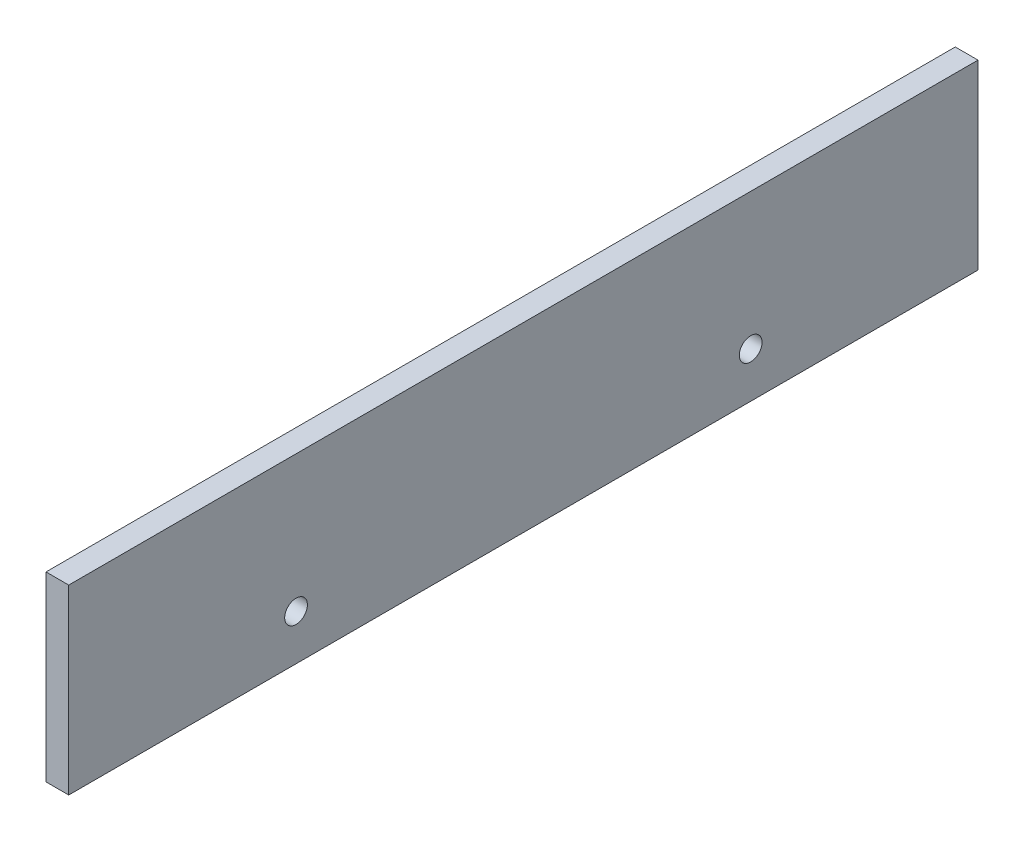
ISO-10303-21;
HEADER;
FILE_DESCRIPTION(('STEP AP214'),'2;1');
FILE_NAME('part.step','',(''),(''),'','','');
FILE_SCHEMA(('AUTOMOTIVE_DESIGN { 1 0 10303 214 1 1 1 1 }'));
ENDSEC;
DATA;
#1=APPLICATION_CONTEXT('core data for automotive mechanical design processes');
#2=APPLICATION_PROTOCOL_DEFINITION('international standard','automotive_design',2000,#1);
#3=PRODUCT_CONTEXT('',#1,'mechanical');
#4=PRODUCT('Part','Part','',(#3));
#5=PRODUCT_RELATED_PRODUCT_CATEGORY('part','',(#4));
#6=PRODUCT_DEFINITION_FORMATION('','',#4);
#7=PRODUCT_DEFINITION_CONTEXT('part definition',#1,'design');
#8=PRODUCT_DEFINITION('design','',#6,#7);
#9=PRODUCT_DEFINITION_SHAPE('','',#8);
#10=(LENGTH_UNIT() NAMED_UNIT(*) SI_UNIT(.MILLI.,.METRE.));
#11=(NAMED_UNIT(*) PLANE_ANGLE_UNIT() SI_UNIT($,.RADIAN.));
#12=(NAMED_UNIT(*) SI_UNIT($,.STERADIAN.) SOLID_ANGLE_UNIT());
#13=UNCERTAINTY_MEASURE_WITH_UNIT(LENGTH_MEASURE(1.E-05),#10,'distance_accuracy_value','');
#14=(GEOMETRIC_REPRESENTATION_CONTEXT(3) GLOBAL_UNCERTAINTY_ASSIGNED_CONTEXT((#13)) GLOBAL_UNIT_ASSIGNED_CONTEXT((#10,
#11,#12)) REPRESENTATION_CONTEXT('',''));
#15=CARTESIAN_POINT('',(0.,0.,0.));
#16=DIRECTION('',(0.,0.,1.));
#17=DIRECTION('',(1.,0.,0.));
#18=AXIS2_PLACEMENT_3D('',#15,#16,#17);
#19=CARTESIAN_POINT('',(2.5,20.,200.));
#20=DIRECTION('',(-1.,0.,0.));
#21=DIRECTION('',(0.,-1.,0.));
#22=AXIS2_PLACEMENT_3D('',#19,#20,#21);
#23=PLANE('',#22);
#24=DIRECTION('',(0.,1.,0.));
#25=VECTOR('',#24,1.);
#26=CARTESIAN_POINT('',(2.5,20.,0.));
#27=LINE('',#26,#25);
#28=CARTESIAN_POINT('',(2.5,-20.,0.));
#29=VERTEX_POINT('',#28);
#30=CARTESIAN_POINT('',(2.5,20.,0.));
#31=VERTEX_POINT('',#30);
#32=EDGE_CURVE('E115',#29,#31,#27,.T.);
#33=ORIENTED_EDGE('',*,*,#32,.T.);
#34=DIRECTION('',(0.,0.,-1.));
#35=VECTOR('',#34,1.);
#36=CARTESIAN_POINT('',(2.5,20.,200.));
#37=LINE('',#36,#35);
#38=CARTESIAN_POINT('',(2.5,20.,200.));
#39=VERTEX_POINT('',#38);
#40=EDGE_CURVE('E11',#39,#31,#37,.T.);
#41=ORIENTED_EDGE('',*,*,#40,.F.);
#42=DIRECTION('',(0.,1.,0.));
#43=VECTOR('',#42,1.);
#44=CARTESIAN_POINT('',(2.5,20.,200.));
#45=LINE('',#44,#43);
#46=CARTESIAN_POINT('',(2.5,-20.,200.));
#47=VERTEX_POINT('',#46);
#48=EDGE_CURVE('E97',#47,#39,#45,.T.);
#49=ORIENTED_EDGE('',*,*,#48,.F.);
#50=DIRECTION('',(0.,0.,-1.));
#51=VECTOR('',#50,1.);
#52=CARTESIAN_POINT('',(2.5,-20.,200.));
#53=LINE('',#52,#51);
#54=EDGE_CURVE('E111',#47,#29,#53,.T.);
#55=ORIENTED_EDGE('',*,*,#54,.T.);
#56=EDGE_LOOP('',(#33,#41,#49,#55));
#57=FACE_BOUND('',#56,.T.);
#58=CARTESIAN_POINT('',(2.5,-9.99999999999999,50.));
#59=DIRECTION('',(1.,0.,0.));
#60=DIRECTION('',(0.,1.,0.));
#61=AXIS2_PLACEMENT_3D('',#58,#59,#60);
#62=CIRCLE('',#61,2.5);
#63=CARTESIAN_POINT('',(2.5,-7.49999999999999,50.));
#64=VERTEX_POINT('',#63);
#65=EDGE_CURVE('E139',#64,#64,#62,.F.);
#66=ORIENTED_EDGE('',*,*,#65,.T.);
#67=EDGE_LOOP('',(#66));
#68=FACE_BOUND('',#67,.T.);
#69=CARTESIAN_POINT('',(2.5,-10.,150.));
#70=DIRECTION('',(1.,0.,0.));
#71=DIRECTION('',(0.,1.,0.));
#72=AXIS2_PLACEMENT_3D('',#69,#70,#71);
#73=CIRCLE('',#72,2.5);
#74=CARTESIAN_POINT('',(2.5,-7.50000000000001,150.));
#75=VERTEX_POINT('',#74);
#76=EDGE_CURVE('E147',#75,#75,#73,.T.);
#77=ORIENTED_EDGE('',*,*,#76,.F.);
#78=EDGE_LOOP('',(#77));
#79=FACE_BOUND('',#78,.T.);
#80=ADVANCED_FACE('F45',(#57,#68,#79),#23,.F.);
#81=CARTESIAN_POINT('',(-2.5,20.,200.));
#82=DIRECTION('',(1.,0.,0.));
#83=DIRECTION('',(0.,1.,0.));
#84=AXIS2_PLACEMENT_3D('',#81,#82,#83);
#85=PLANE('',#84);
#86=DIRECTION('',(0.,-1.,0.));
#87=VECTOR('',#86,1.);
#88=CARTESIAN_POINT('',(-2.5,20.,0.));
#89=LINE('',#88,#87);
#90=CARTESIAN_POINT('',(-2.5,20.,0.));
#91=VERTEX_POINT('',#90);
#92=CARTESIAN_POINT('',(-2.5,-20.,0.));
#93=VERTEX_POINT('',#92);
#94=EDGE_CURVE('E79',#91,#93,#89,.T.);
#95=ORIENTED_EDGE('',*,*,#94,.T.);
#96=DIRECTION('',(0.,0.,-1.));
#97=VECTOR('',#96,1.);
#98=CARTESIAN_POINT('',(-2.5,-20.,200.));
#99=LINE('',#98,#97);
#100=CARTESIAN_POINT('',(-2.5,-20.,200.));
#101=VERTEX_POINT('',#100);
#102=EDGE_CURVE('E104',#101,#93,#99,.T.);
#103=ORIENTED_EDGE('',*,*,#102,.F.);
#104=DIRECTION('',(0.,-1.,0.));
#105=VECTOR('',#104,1.);
#106=CARTESIAN_POINT('',(-2.5,20.,200.));
#107=LINE('',#106,#105);
#108=CARTESIAN_POINT('',(-2.5,20.,200.));
#109=VERTEX_POINT('',#108);
#110=EDGE_CURVE('E95',#109,#101,#107,.T.);
#111=ORIENTED_EDGE('',*,*,#110,.F.);
#112=DIRECTION('',(0.,0.,-1.));
#113=VECTOR('',#112,1.);
#114=CARTESIAN_POINT('',(-2.5,20.,200.));
#115=LINE('',#114,#113);
#116=EDGE_CURVE('E54',#109,#91,#115,.T.);
#117=ORIENTED_EDGE('',*,*,#116,.T.);
#118=EDGE_LOOP('',(#95,#103,#111,#117));
#119=FACE_BOUND('',#118,.T.);
#120=CARTESIAN_POINT('',(-2.5,-9.99999999999999,50.));
#121=DIRECTION('',(1.,0.,0.));
#122=DIRECTION('',(0.,1.,0.));
#123=AXIS2_PLACEMENT_3D('',#120,#121,#122);
#124=CIRCLE('',#123,2.5);
#125=CARTESIAN_POINT('',(-2.5,-7.49999999999999,50.));
#126=VERTEX_POINT('',#125);
#127=EDGE_CURVE('E143',#126,#126,#124,.F.);
#128=ORIENTED_EDGE('',*,*,#127,.F.);
#129=EDGE_LOOP('',(#128));
#130=FACE_BOUND('',#129,.T.);
#131=CARTESIAN_POINT('',(-2.5,-10.,150.));
#132=DIRECTION('',(1.,0.,0.));
#133=DIRECTION('',(0.,1.,0.));
#134=AXIS2_PLACEMENT_3D('',#131,#132,#133);
#135=CIRCLE('',#134,2.5);
#136=CARTESIAN_POINT('',(-2.5,-7.50000000000001,150.));
#137=VERTEX_POINT('',#136);
#138=EDGE_CURVE('E119',#137,#137,#135,.T.);
#139=ORIENTED_EDGE('',*,*,#138,.T.);
#140=EDGE_LOOP('',(#139));
#141=FACE_BOUND('',#140,.T.);
#142=ADVANCED_FACE('F105',(#119,#130,#141),#85,.F.);
#143=CARTESIAN_POINT('',(-2.5,20.,200.));
#144=DIRECTION('',(0.,-1.,0.));
#145=DIRECTION('',(0.,0.,-1.));
#146=AXIS2_PLACEMENT_3D('',#143,#144,#145);
#147=PLANE('',#146);
#148=DIRECTION('',(-1.,0.,0.));
#149=VECTOR('',#148,1.);
#150=CARTESIAN_POINT('',(-2.5,20.,0.));
#151=LINE('',#150,#149);
#152=EDGE_CURVE('E102',#31,#91,#151,.T.);
#153=ORIENTED_EDGE('',*,*,#152,.T.);
#154=ORIENTED_EDGE('',*,*,#116,.F.);
#155=DIRECTION('',(-1.,0.,0.));
#156=VECTOR('',#155,1.);
#157=CARTESIAN_POINT('',(-2.5,20.,200.));
#158=LINE('',#157,#156);
#159=EDGE_CURVE('E92',#39,#109,#158,.T.);
#160=ORIENTED_EDGE('',*,*,#159,.F.);
#161=ORIENTED_EDGE('',*,*,#40,.T.);
#162=EDGE_LOOP('',(#153,#154,#160,#161));
#163=FACE_BOUND('',#162,.T.);
#164=ADVANCED_FACE('F101',(#163),#147,.F.);
#165=CARTESIAN_POINT('',(-2.5,-20.,200.));
#166=DIRECTION('',(0.,1.,0.));
#167=DIRECTION('',(0.,0.,1.));
#168=AXIS2_PLACEMENT_3D('',#165,#166,#167);
#169=PLANE('',#168);
#170=DIRECTION('',(1.,0.,0.));
#171=VECTOR('',#170,1.);
#172=CARTESIAN_POINT('',(-2.5,-20.,0.));
#173=LINE('',#172,#171);
#174=EDGE_CURVE('E85',#93,#29,#173,.T.);
#175=ORIENTED_EDGE('',*,*,#174,.T.);
#176=ORIENTED_EDGE('',*,*,#54,.F.);
#177=DIRECTION('',(1.,0.,0.));
#178=VECTOR('',#177,1.);
#179=CARTESIAN_POINT('',(-2.5,-20.,200.));
#180=LINE('',#179,#178);
#181=EDGE_CURVE('E62',#101,#47,#180,.T.);
#182=ORIENTED_EDGE('',*,*,#181,.F.);
#183=ORIENTED_EDGE('',*,*,#102,.T.);
#184=EDGE_LOOP('',(#175,#176,#182,#183));
#185=FACE_BOUND('',#184,.T.);
#186=ADVANCED_FACE('F130',(#185),#169,.F.);
#187=CARTESIAN_POINT('',(0.,0.,200.));
#188=DIRECTION('',(0.,0.,1.));
#189=DIRECTION('',(1.,0.,0.));
#190=AXIS2_PLACEMENT_3D('',#187,#188,#189);
#191=PLANE('',#190);
#192=ORIENTED_EDGE('',*,*,#48,.T.);
#193=ORIENTED_EDGE('',*,*,#159,.T.);
#194=ORIENTED_EDGE('',*,*,#110,.T.);
#195=ORIENTED_EDGE('',*,*,#181,.T.);
#196=EDGE_LOOP('',(#192,#193,#194,#195));
#197=FACE_BOUND('',#196,.T.);
#198=ADVANCED_FACE('F93',(#197),#191,.T.);
#199=CARTESIAN_POINT('',(0.,0.,0.));
#200=DIRECTION('',(0.,0.,1.));
#201=DIRECTION('',(1.,0.,0.));
#202=AXIS2_PLACEMENT_3D('',#199,#200,#201);
#203=PLANE('',#202);
#204=ORIENTED_EDGE('',*,*,#32,.F.);
#205=ORIENTED_EDGE('',*,*,#174,.F.);
#206=ORIENTED_EDGE('',*,*,#94,.F.);
#207=ORIENTED_EDGE('',*,*,#152,.F.);
#208=EDGE_LOOP('',(#204,#205,#206,#207));
#209=FACE_BOUND('',#208,.T.);
#210=ADVANCED_FACE('F133',(#209),#203,.F.);
#211=CARTESIAN_POINT('',(-2.5,-9.99999999999999,50.));
#212=DIRECTION('',(1.,0.,0.));
#213=DIRECTION('',(0.,1.,0.));
#214=AXIS2_PLACEMENT_3D('',#211,#212,#213);
#215=CYLINDRICAL_SURFACE('',#214,2.5);
#216=ORIENTED_EDGE('',*,*,#127,.T.);
#217=EDGE_LOOP('',(#216));
#218=FACE_BOUND('',#217,.T.);
#219=ORIENTED_EDGE('',*,*,#65,.F.);
#220=EDGE_LOOP('',(#219));
#221=FACE_BOUND('',#220,.T.);
#222=ADVANCED_FACE('F160',(#218,#221),#215,.F.);
#223=CARTESIAN_POINT('',(-2.5,-10.,150.));
#224=DIRECTION('',(1.,0.,0.));
#225=DIRECTION('',(0.,1.,0.));
#226=AXIS2_PLACEMENT_3D('',#223,#224,#225);
#227=CYLINDRICAL_SURFACE('',#226,2.5);
#228=ORIENTED_EDGE('',*,*,#138,.F.);
#229=EDGE_LOOP('',(#228));
#230=FACE_BOUND('',#229,.T.);
#231=ORIENTED_EDGE('',*,*,#76,.T.);
#232=EDGE_LOOP('',(#231));
#233=FACE_BOUND('',#232,.T.);
#234=ADVANCED_FACE('F157',(#230,#233),#227,.F.);
#235=CLOSED_SHELL('',(#80,#142,#164,#186,#198,#210,#222,#234));
#236=MANIFOLD_SOLID_BREP('B2',#235);
#237=ADVANCED_BREP_SHAPE_REPRESENTATION('',(#18,#236),#14);
#238=SHAPE_DEFINITION_REPRESENTATION(#9,#237);
ENDSEC;
END-ISO-10303-21;
